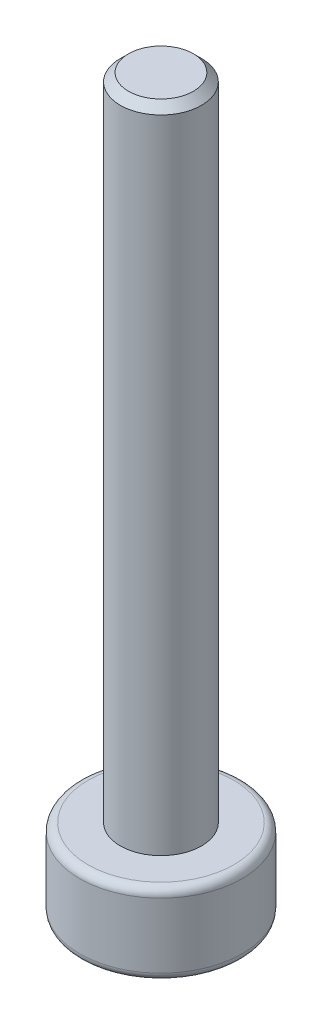
ISO-10303-21;
HEADER;
FILE_DESCRIPTION(('STEP AP214'),'2;1');
FILE_NAME('part.step','',(''),(''),'','','');
FILE_SCHEMA(('AUTOMOTIVE_DESIGN { 1 0 10303 214 1 1 1 1 }'));
ENDSEC;
DATA;
#1=APPLICATION_CONTEXT('core data for automotive mechanical design processes');
#2=APPLICATION_PROTOCOL_DEFINITION('international standard','automotive_design',2000,#1);
#3=PRODUCT_CONTEXT('',#1,'mechanical');
#4=PRODUCT('Part','Part','',(#3));
#5=PRODUCT_RELATED_PRODUCT_CATEGORY('part','',(#4));
#6=PRODUCT_DEFINITION_FORMATION('','',#4);
#7=PRODUCT_DEFINITION_CONTEXT('part definition',#1,'design');
#8=PRODUCT_DEFINITION('design','',#6,#7);
#9=PRODUCT_DEFINITION_SHAPE('','',#8);
#10=(LENGTH_UNIT() NAMED_UNIT(*) SI_UNIT(.MILLI.,.METRE.));
#11=(NAMED_UNIT(*) PLANE_ANGLE_UNIT() SI_UNIT($,.RADIAN.));
#12=(NAMED_UNIT(*) SI_UNIT($,.STERADIAN.) SOLID_ANGLE_UNIT());
#13=UNCERTAINTY_MEASURE_WITH_UNIT(LENGTH_MEASURE(1.E-05),#10,'distance_accuracy_value','');
#14=(GEOMETRIC_REPRESENTATION_CONTEXT(3) GLOBAL_UNCERTAINTY_ASSIGNED_CONTEXT((#13)) GLOBAL_UNIT_ASSIGNED_CONTEXT((#10,
#11,#12)) REPRESENTATION_CONTEXT('',''));
#15=CARTESIAN_POINT('',(0.,0.,0.));
#16=DIRECTION('',(0.,0.,1.));
#17=DIRECTION('',(1.,0.,0.));
#18=AXIS2_PLACEMENT_3D('',#15,#16,#17);
#19=CARTESIAN_POINT('',(0.,2.,0.));
#20=DIRECTION('',(0.,-1.,0.));
#21=DIRECTION('',(0.,0.,-1.));
#22=AXIS2_PLACEMENT_3D('',#19,#20,#21);
#23=CYLINDRICAL_SURFACE('',#22,2.);
#24=CARTESIAN_POINT('',(0.,0.2,0.));
#25=DIRECTION('',(0.,1.,0.));
#26=DIRECTION('',(0.,0.,1.));
#27=AXIS2_PLACEMENT_3D('',#24,#25,#26);
#28=CIRCLE('',#27,2.);
#29=CARTESIAN_POINT('',(0.,0.2,2.));
#30=VERTEX_POINT('',#29);
#31=EDGE_CURVE('E72',#30,#30,#28,.T.);
#32=ORIENTED_EDGE('',*,*,#31,.T.);
#33=EDGE_LOOP('',(#32));
#34=FACE_BOUND('',#33,.T.);
#35=CARTESIAN_POINT('',(0.,1.8,0.));
#36=DIRECTION('',(0.,1.,0.));
#37=DIRECTION('',(0.,0.,1.));
#38=AXIS2_PLACEMENT_3D('',#35,#36,#37);
#39=CIRCLE('',#38,2.);
#40=CARTESIAN_POINT('',(0.,1.8,2.));
#41=VERTEX_POINT('',#40);
#42=EDGE_CURVE('E76',#41,#41,#39,.F.);
#43=ORIENTED_EDGE('',*,*,#42,.T.);
#44=EDGE_LOOP('',(#43));
#45=FACE_BOUND('',#44,.T.);
#46=ADVANCED_FACE('F39',(#34,#45),#23,.T.);
#47=CARTESIAN_POINT('',(0.,2.,0.));
#48=DIRECTION('',(0.,1.,0.));
#49=DIRECTION('',(0.,0.,1.));
#50=AXIS2_PLACEMENT_3D('',#47,#48,#49);
#51=PLANE('',#50);
#52=CARTESIAN_POINT('',(0.,2.,0.));
#53=DIRECTION('',(0.,1.,0.));
#54=DIRECTION('',(0.,0.,1.));
#55=AXIS2_PLACEMENT_3D('',#52,#53,#54);
#56=CIRCLE('',#55,1.8);
#57=CARTESIAN_POINT('',(0.,2.,1.8));
#58=VERTEX_POINT('',#57);
#59=EDGE_CURVE('E64',#58,#58,#56,.T.);
#60=ORIENTED_EDGE('',*,*,#59,.T.);
#61=EDGE_LOOP('',(#60));
#62=FACE_BOUND('',#61,.T.);
#63=CARTESIAN_POINT('',(0.,2.,0.));
#64=DIRECTION('',(0.,1.,0.));
#65=DIRECTION('',(0.,0.,1.));
#66=AXIS2_PLACEMENT_3D('',#63,#64,#65);
#67=CIRCLE('',#66,1.);
#68=CARTESIAN_POINT('',(0.,2.,1.));
#69=VERTEX_POINT('',#68);
#70=EDGE_CURVE('E80',#69,#69,#67,.T.);
#71=ORIENTED_EDGE('',*,*,#70,.F.);
#72=EDGE_LOOP('',(#71));
#73=FACE_BOUND('',#72,.T.);
#74=ADVANCED_FACE('F107',(#62,#73),#51,.T.);
#75=CARTESIAN_POINT('',(0.,0.,0.));
#76=DIRECTION('',(0.,1.,0.));
#77=DIRECTION('',(0.,0.,1.));
#78=AXIS2_PLACEMENT_3D('',#75,#76,#77);
#79=PLANE('',#78);
#80=CARTESIAN_POINT('',(0.,0.,0.));
#81=DIRECTION('',(0.,1.,0.));
#82=DIRECTION('',(0.,0.,1.));
#83=AXIS2_PLACEMENT_3D('',#80,#81,#82);
#84=CIRCLE('',#83,0.864999999999999);
#85=CARTESIAN_POINT('',(0.,0.,0.864999999999999));
#86=VERTEX_POINT('',#85);
#87=EDGE_CURVE('E53',#86,#86,#84,.T.);
#88=ORIENTED_EDGE('',*,*,#87,.T.);
#89=EDGE_LOOP('',(#88));
#90=FACE_BOUND('',#89,.T.);
#91=CARTESIAN_POINT('',(0.,0.,0.));
#92=DIRECTION('',(0.,1.,0.));
#93=DIRECTION('',(0.,0.,1.));
#94=AXIS2_PLACEMENT_3D('',#91,#92,#93);
#95=CIRCLE('',#94,1.8);
#96=CARTESIAN_POINT('',(0.,0.,1.8));
#97=VERTEX_POINT('',#96);
#98=EDGE_CURVE('E68',#97,#97,#95,.F.);
#99=ORIENTED_EDGE('',*,*,#98,.T.);
#100=EDGE_LOOP('',(#99));
#101=FACE_BOUND('',#100,.T.);
#102=ADVANCED_FACE('F113',(#90,#101),#79,.F.);
#103=CARTESIAN_POINT('',(0.,18.,0.));
#104=DIRECTION('',(0.,-1.,0.));
#105=DIRECTION('',(0.,0.,-1.));
#106=AXIS2_PLACEMENT_3D('',#103,#104,#105);
#107=CYLINDRICAL_SURFACE('',#106,1.);
#108=CARTESIAN_POINT('',(0.,17.8,0.));
#109=DIRECTION('',(0.,1.,0.));
#110=DIRECTION('',(0.,0.,1.));
#111=AXIS2_PLACEMENT_3D('',#108,#109,#110);
#112=CIRCLE('',#111,1.);
#113=CARTESIAN_POINT('',(0.,17.8,1.));
#114=VERTEX_POINT('',#113);
#115=EDGE_CURVE('E10',#114,#114,#112,.F.);
#116=ORIENTED_EDGE('',*,*,#115,.T.);
#117=EDGE_LOOP('',(#116));
#118=FACE_BOUND('',#117,.T.);
#119=ORIENTED_EDGE('',*,*,#70,.T.);
#120=EDGE_LOOP('',(#119));
#121=FACE_BOUND('',#120,.T.);
#122=ADVANCED_FACE('F137',(#118,#121),#107,.T.);
#123=CARTESIAN_POINT('',(0.,18.,0.));
#124=DIRECTION('',(0.,1.,0.));
#125=DIRECTION('',(0.,0.,1.));
#126=AXIS2_PLACEMENT_3D('',#123,#124,#125);
#127=PLANE('',#126);
#128=CARTESIAN_POINT('',(0.,18.,0.));
#129=DIRECTION('',(0.,1.,0.));
#130=DIRECTION('',(0.,0.,1.));
#131=AXIS2_PLACEMENT_3D('',#128,#129,#130);
#132=CIRCLE('',#131,0.8);
#133=CARTESIAN_POINT('',(0.,18.,0.8));
#134=VERTEX_POINT('',#133);
#135=EDGE_CURVE('E48',#134,#134,#132,.T.);
#136=ORIENTED_EDGE('',*,*,#135,.T.);
#137=EDGE_LOOP('',(#136));
#138=FACE_BOUND('',#137,.T.);
#139=ADVANCED_FACE('F120',(#138),#127,.T.);
#140=CARTESIAN_POINT('',(0.,0.2,0.));
#141=DIRECTION('',(0.,1.,0.));
#142=DIRECTION('',(0.,0.,1.));
#143=AXIS2_PLACEMENT_3D('',#140,#141,#142);
#144=TOROIDAL_SURFACE('',#143,1.8,0.2);
#145=ORIENTED_EDGE('',*,*,#98,.F.);
#146=EDGE_LOOP('',(#145));
#147=FACE_BOUND('',#146,.T.);
#148=ORIENTED_EDGE('',*,*,#31,.F.);
#149=EDGE_LOOP('',(#148));
#150=FACE_BOUND('',#149,.T.);
#151=ADVANCED_FACE('F102',(#147,#150),#144,.T.);
#152=CARTESIAN_POINT('',(0.,1.8,0.));
#153=DIRECTION('',(0.,1.,0.));
#154=DIRECTION('',(0.,0.,1.));
#155=AXIS2_PLACEMENT_3D('',#152,#153,#154);
#156=TOROIDAL_SURFACE('',#155,1.8,0.2);
#157=ORIENTED_EDGE('',*,*,#42,.F.);
#158=EDGE_LOOP('',(#157));
#159=FACE_BOUND('',#158,.T.);
#160=ORIENTED_EDGE('',*,*,#59,.F.);
#161=EDGE_LOOP('',(#160));
#162=FACE_BOUND('',#161,.T.);
#163=ADVANCED_FACE('F93',(#159,#162),#156,.T.);
#164=CARTESIAN_POINT('',(0.,1.52,0.));
#165=DIRECTION('',(0.,-1.,0.));
#166=DIRECTION('',(0.,0.,-1.));
#167=AXIS2_PLACEMENT_3D('',#164,#165,#166);
#168=CYLINDRICAL_SURFACE('',#167,0.765);
#169=CARTESIAN_POINT('',(0.,0.0999999999999985,0.));
#170=DIRECTION('',(0.,1.,0.));
#171=DIRECTION('',(0.,0.,1.));
#172=AXIS2_PLACEMENT_3D('',#169,#170,#171);
#173=CIRCLE('',#172,0.765);
#174=CARTESIAN_POINT('',(0.,0.0999999999999985,0.765));
#175=VERTEX_POINT('',#174);
#176=EDGE_CURVE('E58',#175,#175,#173,.F.);
#177=ORIENTED_EDGE('',*,*,#176,.T.);
#178=EDGE_LOOP('',(#177));
#179=FACE_BOUND('',#178,.T.);
#180=CARTESIAN_POINT('',(0.,1.52,0.));
#181=DIRECTION('',(0.,-1.,0.));
#182=DIRECTION('',(0.,0.,-1.));
#183=AXIS2_PLACEMENT_3D('',#180,#181,#182);
#184=CIRCLE('',#183,0.765);
#185=CARTESIAN_POINT('',(0.,1.52,-0.765));
#186=VERTEX_POINT('',#185);
#187=EDGE_CURVE('E84',#186,#186,#184,.T.);
#188=ORIENTED_EDGE('',*,*,#187,.F.);
#189=EDGE_LOOP('',(#188));
#190=FACE_BOUND('',#189,.T.);
#191=ADVANCED_FACE('F91',(#179,#190),#168,.F.);
#192=CARTESIAN_POINT('',(0.,1.52,0.));
#193=DIRECTION('',(0.,-1.,0.));
#194=DIRECTION('',(0.,0.,-1.));
#195=AXIS2_PLACEMENT_3D('',#192,#193,#194);
#196=PLANE('',#195);
#197=ORIENTED_EDGE('',*,*,#187,.T.);
#198=EDGE_LOOP('',(#197));
#199=FACE_BOUND('',#198,.T.);
#200=ADVANCED_FACE('F89',(#199),#196,.T.);
#201=CARTESIAN_POINT('',(0.,0.0999999999999985,0.));
#202=DIRECTION('',(0.,-1.,0.));
#203=DIRECTION('',(0.,0.,-1.));
#204=AXIS2_PLACEMENT_3D('',#201,#202,#203);
#205=CONICAL_SURFACE('',#204,0.765,0.785398163397452);
#206=ORIENTED_EDGE('',*,*,#87,.F.);
#207=EDGE_LOOP('',(#206));
#208=FACE_BOUND('',#207,.T.);
#209=ORIENTED_EDGE('',*,*,#176,.F.);
#210=EDGE_LOOP('',(#209));
#211=FACE_BOUND('',#210,.T.);
#212=ADVANCED_FACE('F100',(#208,#211),#205,.F.);
#213=CARTESIAN_POINT('',(0.,18.,0.));
#214=DIRECTION('',(0.,-1.,0.));
#215=DIRECTION('',(0.,0.,-1.));
#216=AXIS2_PLACEMENT_3D('',#213,#214,#215);
#217=CONICAL_SURFACE('',#216,0.8,0.785398163397442);
#218=ORIENTED_EDGE('',*,*,#115,.F.);
#219=EDGE_LOOP('',(#218));
#220=FACE_BOUND('',#219,.T.);
#221=ORIENTED_EDGE('',*,*,#135,.F.);
#222=EDGE_LOOP('',(#221));
#223=FACE_BOUND('',#222,.T.);
#224=ADVANCED_FACE('F42',(#220,#223),#217,.T.);
#225=CLOSED_SHELL('',(#46,#74,#102,#122,#139,#151,#163,#191,#200,#212,#224));
#226=MANIFOLD_SOLID_BREP('B2',#225);
#227=ADVANCED_BREP_SHAPE_REPRESENTATION('',(#18,#226),#14);
#228=SHAPE_DEFINITION_REPRESENTATION(#9,#227);
ENDSEC;
END-ISO-10303-21;
